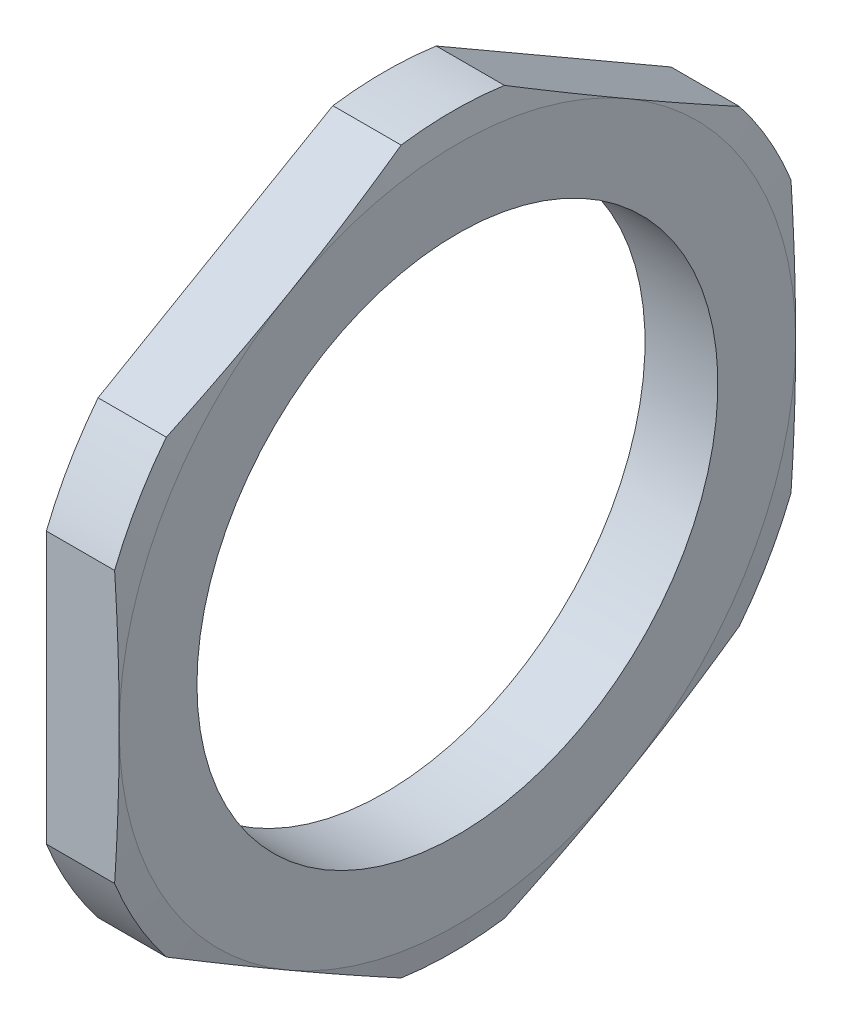
ISO-10303-21;
HEADER;
FILE_DESCRIPTION(('STEP AP214'),'2;1');
FILE_NAME('part.step','',(''),(''),'','','');
FILE_SCHEMA(('AUTOMOTIVE_DESIGN { 1 0 10303 214 1 1 1 1 }'));
ENDSEC;
DATA;
#1=APPLICATION_CONTEXT('core data for automotive mechanical design processes');
#2=APPLICATION_PROTOCOL_DEFINITION('international standard','automotive_design',2000,#1);
#3=PRODUCT_CONTEXT('',#1,'mechanical');
#4=PRODUCT('Part','Part','',(#3));
#5=PRODUCT_RELATED_PRODUCT_CATEGORY('part','',(#4));
#6=PRODUCT_DEFINITION_FORMATION('','',#4);
#7=PRODUCT_DEFINITION_CONTEXT('part definition',#1,'design');
#8=PRODUCT_DEFINITION('design','',#6,#7);
#9=PRODUCT_DEFINITION_SHAPE('','',#8);
#10=(LENGTH_UNIT() NAMED_UNIT(*) SI_UNIT(.MILLI.,.METRE.));
#11=(NAMED_UNIT(*) PLANE_ANGLE_UNIT() SI_UNIT($,.RADIAN.));
#12=(NAMED_UNIT(*) SI_UNIT($,.STERADIAN.) SOLID_ANGLE_UNIT());
#13=UNCERTAINTY_MEASURE_WITH_UNIT(LENGTH_MEASURE(1.E-05),#10,'distance_accuracy_value','');
#14=(GEOMETRIC_REPRESENTATION_CONTEXT(3) GLOBAL_UNCERTAINTY_ASSIGNED_CONTEXT((#13)) GLOBAL_UNIT_ASSIGNED_CONTEXT((#10,
#11,#12)) REPRESENTATION_CONTEXT('',''));
#15=CARTESIAN_POINT('',(0.,0.,0.));
#16=DIRECTION('',(0.,0.,1.));
#17=DIRECTION('',(1.,0.,0.));
#18=AXIS2_PLACEMENT_3D('',#15,#16,#17);
#19=CARTESIAN_POINT('',(-2.003178889877,0.,0.));
#20=DIRECTION('',(-1.,0.,0.));
#21=DIRECTION('',(0.,0.,1.));
#22=AXIS2_PLACEMENT_3D('',#19,#20,#21);
#23=CONICAL_SURFACE('',#22,17.7870529443211,1.39626340159549);
#24=CARTESIAN_POINT('',(-1.778,0.,0.));
#25=DIRECTION('',(1.,0.,0.));
#26=DIRECTION('',(0.,0.,-1.));
#27=AXIS2_PLACEMENT_3D('',#24,#25,#26);
#28=CIRCLE('',#27,16.5099999999999);
#29=CARTESIAN_POINT('',(-1.778,14.298079416481,-8.25499999999996));
#30=VERTEX_POINT('',#29);
#31=CARTESIAN_POINT('',(-1.77800000000001,14.298079416481,8.25499999999997));
#32=VERTEX_POINT('',#31);
#33=EDGE_CURVE('E109',#30,#32,#28,.T.);
#34=ORIENTED_EDGE('',*,*,#33,.F.);
#35=CARTESIAN_POINT('',(-1.77799846604757,14.2980809996564,-8.25500091404666));
#36=CARTESIAN_POINT('',(-1.77799671756424,14.4360834475584,-8.01597135449793));
#37=CARTESIAN_POINT('',(-1.77922046317279,14.5740856921921,-7.77694347656496));
#38=CARTESIAN_POINT('',(-1.78409709700538,14.8500795840297,-7.29890729471618));
#39=CARTESIAN_POINT('',(-1.78774997800014,14.9880712312639,-7.05989899074423));
#40=CARTESIAN_POINT('',(-1.80231684067896,15.4019387656885,-6.34305978118079));
#41=CARTESIAN_POINT('',(-1.81683906597744,15.6777847250945,-5.86528037984335));
#42=CARTESIAN_POINT('',(-1.85508404263868,16.2293055393274,-4.91001816049385));
#43=CARTESIAN_POINT('',(-1.87880653077253,16.5049803988236,-4.43253533438793));
#44=CARTESIAN_POINT('',(-1.93477241380698,17.0561900532299,-3.47781228118609));
#45=CARTESIAN_POINT('',(-1.96701813067364,17.3317247894409,-3.00057215575975));
#46=CARTESIAN_POINT('',(-2.00317889154779,17.6071258343017,-2.52356347973088));
#47=B_SPLINE_CURVE_WITH_KNOTS('',3,(#35,#36,#37,#38,#39,#40,#41,#42,#43,#44,#45,#46),
.UNSPECIFIED.,.F.,.F.,(4,2,2,2,2,4),(0.,0.828014944377781,1.65602742453205,3.31158757359664,
4.96710035889239,6.62306461788218),.UNSPECIFIED.);
#48=CARTESIAN_POINT('',(-2.00317889089068,17.6071258292938,-2.52356348840487));
#49=VERTEX_POINT('',#48);
#50=EDGE_CURVE('E185',#30,#49,#47,.T.);
#51=ORIENTED_EDGE('',*,*,#50,.T.);
#52=CARTESIAN_POINT('',(-2.00317888987693,0.,0.));
#53=DIRECTION('',(-1.,0.,0.));
#54=DIRECTION('',(0.,0.,1.));
#55=AXIS2_PLACEMENT_3D('',#52,#53,#54);
#56=CIRCLE('',#55,17.7870529443207);
#57=CARTESIAN_POINT('',(-2.00317889139763,17.6071258331573,2.52356348171298));
#58=VERTEX_POINT('',#57);
#59=EDGE_CURVE('E181',#58,#49,#56,.T.);
#60=ORIENTED_EDGE('',*,*,#59,.F.);
#61=CARTESIAN_POINT('',(-2.00317907456859,17.6071256533005,2.52356336486872));
#62=CARTESIAN_POINT('',(-1.96701822747545,17.3317246946323,3.00057209251378));
#63=CARTESIAN_POINT('',(-1.93477244686303,17.0561900204164,3.47781225999399));
#64=CARTESIAN_POINT('',(-1.87880649743135,16.5049804287321,4.43253536059044));
#65=CARTESIAN_POINT('',(-1.85508400655677,16.2293055699818,4.91001819204284));
#66=CARTESIAN_POINT('',(-1.81683910075202,15.6777846755708,5.86528038097433));
#67=CARTESIAN_POINT('',(-1.80231694914937,15.4019386352368,6.34305974654894));
#68=CARTESIAN_POINT('',(-1.78774992254349,14.9880712622352,7.0598990674274));
#69=CARTESIAN_POINT('',(-1.78409694112772,14.8500797153681,7.29890743707536));
#70=CARTESIAN_POINT('',(-1.77922061787423,14.5740854942387,7.77694344958506));
#71=CARTESIAN_POINT('',(-1.77799728328799,14.4360828199445,8.0159710925022));
#72=CARTESIAN_POINT('',(-1.77800000000002,14.2980793661624,8.25500008715457));
#73=B_SPLINE_CURVE_WITH_KNOTS('',3,(#61,#62,#63,#64,#65,#66,#67,#68,#69,#70,#71,#72),
.UNSPECIFIED.,.F.,.F.,(4,2,2,2,2,4),(0.,1.65596428385619,3.31147707988383,4.96703725703224,
5.79504975855749,6.62306473134729),.UNSPECIFIED.);
#74=EDGE_CURVE('E200',#58,#32,#73,.T.);
#75=ORIENTED_EDGE('',*,*,#74,.T.);
#76=EDGE_LOOP('',(#34,#51,#60,#75));
#77=FACE_BOUND('',#76,.T.);
#78=ADVANCED_FACE('F17',(#77),#23,.T.);
#79=CARTESIAN_POINT('',(-2.003178889877,0.,0.));
#80=DIRECTION('',(-1.,0.,0.));
#81=DIRECTION('',(0.,0.,1.));
#82=AXIS2_PLACEMENT_3D('',#79,#80,#81);
#83=CONICAL_SURFACE('',#82,17.7870529443211,1.39626340159546);
#84=CARTESIAN_POINT('',(-1.778,0.,0.));
#85=DIRECTION('',(1.,0.,0.));
#86=DIRECTION('',(0.,0.,-1.));
#87=AXIS2_PLACEMENT_3D('',#84,#85,#86);
#88=CIRCLE('',#87,16.5100000000001);
#89=CARTESIAN_POINT('',(-1.77800019243989,-1.51340001591407E-05,16.5100010521019));
#90=VERTEX_POINT('',#89);
#91=EDGE_CURVE('E388',#32,#90,#88,.T.);
#92=ORIENTED_EDGE('',*,*,#91,.F.);
#93=CARTESIAN_POINT('',(-1.77799846604755,14.2980809996563,8.25500091404667));
#94=CARTESIAN_POINT('',(-1.77799671756421,14.1600765527827,8.49402931948862));
#95=CARTESIAN_POINT('',(-1.77922046317275,14.022073460597,8.73305670808714));
#96=CARTESIAN_POINT('',(-1.78409709700534,13.7460789291066,9.21109252063224));
#97=CARTESIAN_POINT('',(-1.7877499780001,13.6080874897686,9.45010094463314));
#98=CARTESIAN_POINT('',(-1.80231684067892,13.1942202910702,10.1669403480282));
#99=CARTESIAN_POINT('',(-1.81683906597741,12.91837417181,10.6447196570738));
#100=CARTESIAN_POINT('',(-1.85508404263865,12.3668532296943,11.5999818025901));
#101=CARTESIAN_POINT('',(-1.87880653077251,12.0911784021639,12.0774646471515));
#102=CARTESIAN_POINT('',(-1.93477241380697,11.5399688117156,13.0321877372795));
#103=CARTESIAN_POINT('',(-1.96701813067363,11.2644341074966,13.5094278811764));
#104=CARTESIAN_POINT('',(-2.00317889154779,10.9890329986605,13.9864365202691));
#105=B_SPLINE_CURVE_WITH_KNOTS('',3,(#93,#94,#95,#96,#97,#98,#99,#100,#101,#102,#103,#104),
.UNSPECIFIED.,.F.,.F.,(4,2,2,2,2,4),(0.,0.828014944377781,1.65602742453206,3.31158757359664,
4.9671003588924,6.62306461788219),.UNSPECIFIED.);
#106=CARTESIAN_POINT('',(-2.00317889089068,10.9890330036684,13.9864365115951));
#107=VERTEX_POINT('',#106);
#108=EDGE_CURVE('E178',#32,#107,#105,.T.);
#109=ORIENTED_EDGE('',*,*,#108,.T.);
#110=CARTESIAN_POINT('',(-2.00317888987693,0.,0.));
#111=DIRECTION('',(-1.,0.,0.));
#112=DIRECTION('',(0.,0.,1.));
#113=AXIS2_PLACEMENT_3D('',#110,#111,#112);
#114=CIRCLE('',#113,17.7870529443207);
#115=CARTESIAN_POINT('',(-2.00317888897074,6.61809279636093,16.51));
#116=VERTEX_POINT('',#115);
#117=EDGE_CURVE('E174',#116,#107,#114,.T.);
#118=ORIENTED_EDGE('',*,*,#117,.F.);
#119=CARTESIAN_POINT('',(-2.00317877981935,6.6180927896501,16.5100001276313));
#120=CARTESIAN_POINT('',(-1.96701803710825,6.06728937750174,16.5100000457611));
#121=CARTESIAN_POINT('',(-1.93477226899158,5.51621867993884,16.5100000122444));
#122=CARTESIAN_POINT('',(-1.87880628803841,4.41379692625598,16.5099999877589));
#123=CARTESIAN_POINT('',(-1.85508375316174,3.8624459875375,16.5099999967786));
#124=CARTESIAN_POINT('',(-1.81683882997163,2.75940171885733,16.5100000032215));
#125=CARTESIAN_POINT('',(-1.80231670500857,2.20770837954724,16.5100000006444));
#126=CARTESIAN_POINT('',(-1.78774974606916,1.37997175446904,16.5099999996777));
#127=CARTESIAN_POINT('',(-1.78409679183247,1.10398803573921,16.5099999998389));
#128=CARTESIAN_POINT('',(-1.77922053423853,0.551998343877247,16.5100000001612));
#129=CARTESIAN_POINT('',(-1.77799723813147,0.275992370681165,16.5100000003223));
#130=CARTESIAN_POINT('',(-1.77800000000122,-1.51627719128148E-05,16.51));
#131=B_SPLINE_CURVE_WITH_KNOTS('',3,(#119,#120,#121,#122,#123,#124,#125,#126,#127,#128,#129,
#130),.UNSPECIFIED.,.F.,.F.,(4,2,2,2,2,4),(0.,1.65596802990641,3.31148457091046,
4.96704849689214,5.79506287355029,6.62307972103164),.UNSPECIFIED.);
#132=EDGE_CURVE('E198',#116,#90,#131,.T.);
#133=ORIENTED_EDGE('',*,*,#132,.T.);
#134=EDGE_LOOP('',(#92,#109,#118,#133));
#135=FACE_BOUND('',#134,.T.);
#136=ADVANCED_FACE('F316',(#135),#83,.T.);
#137=CARTESIAN_POINT('',(-2.003178889877,0.,0.));
#138=DIRECTION('',(-1.,0.,0.));
#139=DIRECTION('',(0.,0.,1.));
#140=AXIS2_PLACEMENT_3D('',#137,#138,#139);
#141=CONICAL_SURFACE('',#140,17.7870529443211,1.39626340159556);
#142=CARTESIAN_POINT('',(-1.77800000000017,0.,0.));
#143=DIRECTION('',(-1.,0.,0.));
#144=DIRECTION('',(0.,0.,1.));
#145=AXIS2_PLACEMENT_3D('',#142,#143,#144);
#146=CIRCLE('',#145,16.5100000000002);
#147=CARTESIAN_POINT('',(-1.7780011290956,-14.2980865322122,8.25499254484056));
#148=VERTEX_POINT('',#147);
#149=EDGE_CURVE('E379',#90,#148,#146,.F.);
#150=ORIENTED_EDGE('',*,*,#149,.F.);
#151=CARTESIAN_POINT('',(-1.77799956145328,-1.51340002611279E-05,16.5100005226412));
#152=CARTESIAN_POINT('',(-1.77799716605554,-0.276021875997781,16.5100001926888));
#153=CARTESIAN_POINT('',(-1.77922066169119,-0.552027058080627,16.510000052791));
#154=CARTESIAN_POINT('',(-1.78409715762046,-1.10401516835559,16.5099999472092));
#155=CARTESIAN_POINT('',(-1.78775015066951,-1.37999809661161,16.5099999815248));
#156=CARTESIAN_POINT('',(-1.80231724472291,-2.20773235198192,16.5100000369401));
#157=CARTESIAN_POINT('',(-1.81683948467552,-2.75942411119049,16.5100000105544));
#158=CARTESIAN_POINT('',(-1.85508454171437,-3.86246522297798,16.5099999894459));
#159=CARTESIAN_POINT('',(-1.87880709549238,-4.41381458490386,16.5099999947222));
#160=CARTESIAN_POINT('',(-1.9347730946568,-5.51623318198397,16.5100000052792));
#161=CARTESIAN_POINT('',(-1.96701886204711,-6.06730229973811,16.5100000105598));
#162=CARTESIAN_POINT('',(-2.00317963260143,-6.61810413104344,16.51));
#163=B_SPLINE_CURVE_WITH_KNOTS('',3,(#151,#152,#153,#154,#155,#156,#157,#158,#159,#160,#161,
#162),.UNSPECIFIED.,.F.,.F.,(4,2,2,2,2,4),(0.,0.828014476877051,1.65602648468958,
3.31158568072197,4.96709749900175,6.62306079888207),.UNSPECIFIED.);
#164=CARTESIAN_POINT('',(-2.00317888987693,-6.61809281017337,16.51));
#165=VERTEX_POINT('',#164);
#166=EDGE_CURVE('E150',#90,#165,#163,.T.);
#167=ORIENTED_EDGE('',*,*,#166,.T.);
#168=CARTESIAN_POINT('',(-2.00317888987693,0.,0.));
#169=DIRECTION('',(-1.,0.,0.));
#170=DIRECTION('',(0.,0.,1.));
#171=AXIS2_PLACEMENT_3D('',#168,#169,#170);
#172=CIRCLE('',#171,17.7870529443207);
#173=CARTESIAN_POINT('',(-2.00317913191549,-10.9890403459251,13.9864307612967));
#174=VERTEX_POINT('',#173);
#175=EDGE_CURVE('E145',#174,#165,#172,.T.);
#176=ORIENTED_EDGE('',*,*,#175,.F.);
#177=CARTESIAN_POINT('',(-2.00317694921295,-10.9890386642653,13.9864299557425));
#178=CARTESIAN_POINT('',(-1.96701713613776,-11.2644389227295,13.5094206318302));
#179=CARTESIAN_POINT('',(-1.93477180238271,-11.5399733421454,13.0321801650695));
#180=CARTESIAN_POINT('',(-1.87880623360157,-12.0911828178718,12.0774567242714));
#181=CARTESIAN_POINT('',(-1.85508367671832,-12.3668578153589,11.5999738518239));
#182=CARTESIAN_POINT('',(-1.81683878722875,-12.9183788832443,10.6447115047925));
#183=CARTESIAN_POINT('',(-1.80231671805879,-13.1942249583146,10.1669320221078));
#184=CARTESIAN_POINT('',(-1.78774978404594,-13.6080924089697,9.45009254536881));
#185=CARTESIAN_POINT('',(-1.78409682832004,-13.7460839855706,9.21108412778113));
#186=CARTESIAN_POINT('',(-1.77922055766574,-14.0220782656426,8.73304802030139));
#187=CARTESIAN_POINT('',(-1.7779972499817,-14.1600809691456,8.494020330354));
#188=CARTESIAN_POINT('',(-1.77800000000067,-14.2980844476179,8.25499128581545));
#189=B_SPLINE_CURVE_WITH_KNOTS('',3,(#177,#178,#179,#180,#181,#182,#183,#184,#185,#186,#187,
#188),.UNSPECIFIED.,.F.,.F.,(4,2,2,2,2,4),(0.,1.65596460038207,3.31147772419547,4.9670382479563,
5.79505091785781,6.62306605660022),.UNSPECIFIED.);
#190=EDGE_CURVE('E133',#174,#148,#189,.T.);
#191=ORIENTED_EDGE('',*,*,#190,.T.);
#192=EDGE_LOOP('',(#150,#167,#176,#191));
#193=FACE_BOUND('',#192,.T.);
#194=ADVANCED_FACE('F148',(#193),#141,.T.);
#195=CARTESIAN_POINT('',(-2.003178889877,0.,0.));
#196=DIRECTION('',(-1.,0.,0.));
#197=DIRECTION('',(0.,0.,1.));
#198=AXIS2_PLACEMENT_3D('',#195,#196,#197);
#199=CONICAL_SURFACE('',#198,17.7870529443211,1.39626340159549);
#200=CARTESIAN_POINT('',(-1.778,0.,0.));
#201=DIRECTION('',(1.,0.,0.));
#202=DIRECTION('',(0.,0.,-1.));
#203=AXIS2_PLACEMENT_3D('',#200,#201,#202);
#204=CIRCLE('',#203,16.5099999999999);
#205=CARTESIAN_POINT('',(-1.77800112936757,-14.2980865282967,-8.25499255357463));
#206=VERTEX_POINT('',#205);
#207=EDGE_CURVE('E374',#148,#206,#204,.T.);
#208=ORIENTED_EDGE('',*,*,#207,.F.);
#209=CARTESIAN_POINT('',(-1.77799926759856,-14.2980851794967,8.25499176384965));
#210=CARTESIAN_POINT('',(-1.77799704262961,-14.436087943221,8.01596286341289));
#211=CARTESIAN_POINT('',(-1.7792205995235,-14.5740902021391,7.77693547213164));
#212=CARTESIAN_POINT('',(-1.78409711559487,-14.8500838455292,7.2989001065578));
#213=CARTESIAN_POINT('',(-1.78775006753194,-14.9880752300326,7.05989213220947));
#214=CARTESIAN_POINT('',(-1.80231705867501,-15.4019420508162,6.3430539561392));
#215=CARTESIAN_POINT('',(-1.81683925722017,-15.677787634584,5.86527530187843));
#216=CARTESIAN_POINT('',(-1.85508419921897,-16.2293076459522,4.91001455029271));
#217=CARTESIAN_POINT('',(-1.87880667938729,-16.5049820782245,4.43253244487302));
#218=CARTESIAN_POINT('',(-1.93477251966982,-17.0561908794973,3.47781083075091));
#219=CARTESIAN_POINT('',(-1.96701820176927,-17.3317251897984,3.00057142371895));
#220=CARTESIAN_POINT('',(-2.00317889154787,-17.6071258343023,2.5235634797298));
#221=B_SPLINE_CURVE_WITH_KNOTS('',3,(#209,#210,#211,#212,#213,#214,#215,#216,#217,#218,#219,
#220),.UNSPECIFIED.,.F.,.F.,(4,2,2,2,2,4),(0.,0.82801369899923,1.6560249302481,3.31158257674454,
4.96709284948906,6.62305460039651),.UNSPECIFIED.);
#222=CARTESIAN_POINT('',(-2.00317889089073,-17.6071258292942,2.52356348840422));
#223=VERTEX_POINT('',#222);
#224=EDGE_CURVE('E141',#148,#223,#221,.T.);
#225=ORIENTED_EDGE('',*,*,#224,.T.);
#226=CARTESIAN_POINT('',(-2.00317888987693,0.,0.));
#227=DIRECTION('',(-1.,0.,0.));
#228=DIRECTION('',(0.,0.,1.));
#229=AXIS2_PLACEMENT_3D('',#226,#227,#228);
#230=CIRCLE('',#229,17.7870529443207);
#231=CARTESIAN_POINT('',(-2.00317889139763,-17.6071258331573,-2.52356348171298));
#232=VERTEX_POINT('',#231);
#233=EDGE_CURVE('E161',#232,#223,#230,.T.);
#234=ORIENTED_EDGE('',*,*,#233,.F.);
#235=CARTESIAN_POINT('',(-2.00317907456859,-17.6071256533005,-2.52356336486872));
#236=CARTESIAN_POINT('',(-1.96701828253167,-17.3317251129249,-3.00057136800982));
#237=CARTESIAN_POINT('',(-1.93477254490698,-17.0561908574286,-3.47781081024637));
#238=CARTESIAN_POINT('',(-1.87880665447275,-16.5049821033966,-4.43253245998647));
#239=CARTESIAN_POINT('',(-1.85508417962299,-16.2293076635786,-4.91001456582678));
#240=CARTESIAN_POINT('',(-1.81683927615215,-15.6777876073731,-5.86527530294379));
#241=CARTESIAN_POINT('',(-1.80231711085684,-15.4019419863123,-6.34305394231596));
#242=CARTESIAN_POINT('',(-1.78775004073019,-14.9880752423043,-7.05989217374545));
#243=CARTESIAN_POINT('',(-1.78409704097301,-14.85008390521,-7.29890018005625));
#244=CARTESIAN_POINT('',(-1.77922067345824,-14.5740901035469,-7.77693546602915));
#245=CARTESIAN_POINT('',(-1.77799731295209,-14.4360876389461,-8.01596274574665));
#246=CARTESIAN_POINT('',(-1.77800000000055,-14.2980843947946,-8.25499137730811));
#247=B_SPLINE_CURVE_WITH_KNOTS('',3,(#235,#236,#237,#238,#239,#240,#241,#242,#243,#244,#245,
#246),.UNSPECIFIED.,.F.,.F.,(4,2,2,2,2,4),(0.,1.65596176864864,3.31147205166208,
4.96702971556345,5.79504095933411,6.62305467436448),.UNSPECIFIED.);
#248=EDGE_CURVE('E195',#232,#206,#247,.T.);
#249=ORIENTED_EDGE('',*,*,#248,.T.);
#250=EDGE_LOOP('',(#208,#225,#234,#249));
#251=FACE_BOUND('',#250,.T.);
#252=ADVANCED_FACE('F323',(#251),#199,.T.);
#253=CARTESIAN_POINT('',(-2.003178889877,0.,0.));
#254=DIRECTION('',(-1.,0.,0.));
#255=DIRECTION('',(0.,0.,1.));
#256=AXIS2_PLACEMENT_3D('',#253,#254,#255);
#257=CONICAL_SURFACE('',#256,17.7870529443211,1.39626340159556);
#258=CARTESIAN_POINT('',(-1.77800000000017,0.,0.));
#259=DIRECTION('',(-1.,0.,0.));
#260=DIRECTION('',(0.,0.,1.));
#261=AXIS2_PLACEMENT_3D('',#258,#259,#260);
#262=CIRCLE('',#261,16.5100000000002);
#263=CARTESIAN_POINT('',(-1.7780001502572,-1.54263561816451E-05,-16.5100008079701));
#264=VERTEX_POINT('',#263);
#265=EDGE_CURVE('E120',#206,#264,#262,.F.);
#266=ORIENTED_EDGE('',*,*,#265,.F.);
#267=CARTESIAN_POINT('',(-1.77799926723035,-14.298085175116,-8.25499177231513));
#268=CARTESIAN_POINT('',(-1.77799698344867,-14.1600810394538,-8.4940208443012));
#269=CARTESIAN_POINT('',(-1.77922048884761,-14.0220779583684,-8.73304872483112));
#270=CARTESIAN_POINT('',(-1.78409691689137,-13.7460831745484,-9.21108536019805));
#271=CARTESIAN_POINT('',(-1.78774983229572,-13.608091471781,-9.45009411508992));
#272=CARTESIAN_POINT('',(-1.8023167367716,-13.194223559326,-10.1669345522716));
#273=CARTESIAN_POINT('',(-1.81683890808005,-12.9183770646542,-10.644714607957));
#274=CARTESIAN_POINT('',(-1.85508385473913,-12.3668553237679,-11.5999782141107));
#275=CARTESIAN_POINT('',(-1.87880636680099,-12.0911800728789,-12.0774617726722));
#276=CARTESIAN_POINT('',(-1.93477232451012,-11.5399696348082,-13.0321862923521));
#277=CARTESIAN_POINT('',(-1.96701809217266,-11.2644345063268,-13.5094271517988));
#278=CARTESIAN_POINT('',(-2.00317889154778,-10.9890329986605,-13.9864365202691));
#279=B_SPLINE_CURVE_WITH_KNOTS('',3,(#267,#268,#269,#270,#271,#272,#273,#274,#275,#276,#277,
#278),.UNSPECIFIED.,.F.,.F.,(4,2,2,2,2,4),(0.,0.828016202558456,1.65602993735857,
3.3115925864579,4.96710786134659,6.62307461876099),.UNSPECIFIED.);
#280=CARTESIAN_POINT('',(-2.00317889089068,-10.9890330036684,-13.9864365115951));
#281=VERTEX_POINT('',#280);
#282=EDGE_CURVE('E361',#206,#281,#279,.T.);
#283=ORIENTED_EDGE('',*,*,#282,.T.);
#284=CARTESIAN_POINT('',(-2.00317888987693,0.,0.));
#285=DIRECTION('',(-1.,0.,0.));
#286=DIRECTION('',(0.,0.,1.));
#287=AXIS2_PLACEMENT_3D('',#284,#285,#286);
#288=CIRCLE('',#287,17.7870529443207);
#289=CARTESIAN_POINT('',(-2.00317888762255,-6.6180927758113,-16.51));
#290=VERTEX_POINT('',#289);
#291=EDGE_CURVE('E188',#290,#281,#288,.T.);
#292=ORIENTED_EDGE('',*,*,#291,.F.);
#293=CARTESIAN_POINT('',(-2.00317861607968,-6.61809275911634,-16.5100003175164));
#294=CARTESIAN_POINT('',(-1.96701814449294,-6.06729188741381,-16.5100001138428));
#295=CARTESIAN_POINT('',(-1.93477254973528,-5.51622373645653,-16.5100000304612));
#296=CARTESIAN_POINT('',(-1.87880677966648,-4.41380708001064,-16.5099999695471));
#297=CARTESIAN_POINT('',(-1.85508428238203,-3.8624586919202,-16.5099999919859));
#298=CARTESIAN_POINT('',(-1.81683935856875,-2.75941952507059,-16.5100000080143));
#299=CARTESIAN_POINT('',(-1.80231719539624,-2.20772873696276,-16.5100000016031));
#300=CARTESIAN_POINT('',(-1.78775010556557,-1.37999593959417,-16.5099999991982));
#301=CARTESIAN_POINT('',(-1.78409709542268,-1.10401349758221,-16.5099999995991));
#302=CARTESIAN_POINT('',(-1.77922070295601,-0.552026358756787,-16.5100000004009));
#303=CARTESIAN_POINT('',(-1.77799732788163,-0.276021661879372,-16.5100000008018));
#304=CARTESIAN_POINT('',(-1.77800000000139,-1.54043278221378E-05,-16.51));
#305=B_SPLINE_CURVE_WITH_KNOTS('',3,(#293,#294,#295,#296,#297,#298,#299,#300,#301,#302,#303,
#304),.UNSPECIFIED.,.F.,.F.,(4,2,2,2,2,4),(0.,1.65596037385702,3.31146926670616,
4.96702554577414,5.79503609499462,6.62304911477441),.UNSPECIFIED.);
#306=EDGE_CURVE('E191',#290,#264,#305,.T.);
#307=ORIENTED_EDGE('',*,*,#306,.T.);
#308=EDGE_LOOP('',(#266,#283,#292,#307));
#309=FACE_BOUND('',#308,.T.);
#310=ADVANCED_FACE('F248',(#309),#257,.T.);
#311=CARTESIAN_POINT('',(-2.003178889877,0.,0.));
#312=DIRECTION('',(-1.,0.,0.));
#313=DIRECTION('',(0.,0.,1.));
#314=AXIS2_PLACEMENT_3D('',#311,#312,#313);
#315=CONICAL_SURFACE('',#314,17.7870529443211,1.39626340159549);
#316=CARTESIAN_POINT('',(-1.77799966423581,-1.54263562617189E-05,-16.5100004001497));
#317=CARTESIAN_POINT('',(-1.77799711382494,0.275992305963886,-16.5100001475283));
#318=CARTESIAN_POINT('',(-1.7792205006653,0.551998478590549,-16.5100000404183));
#319=CARTESIAN_POINT('',(-1.78409683131576,1.10398857020336,-16.5099999595818));
#320=CARTESIAN_POINT('',(-1.78774976787982,1.37997248925342,-16.5099999858548));
#321=CARTESIAN_POINT('',(-1.80231671075956,2.20770971539273,-16.5100000282824));
#322=CARTESIAN_POINT('',(-1.81683887426306,2.75940345511822,-16.5100000080808));
#323=CARTESIAN_POINT('',(-1.85508385709211,3.86244852644381,-16.5099999919195));
#324=CARTESIAN_POINT('',(-1.87880641309815,4.41379986739124,-16.5099999959592));
#325=CARTESIAN_POINT('',(-1.9347724833187,5.51622242225897,-16.5100000040419));
#326=CARTESIAN_POINT('',(-1.96701831957907,6.06729351877736,-16.5100000080849));
#327=CARTESIAN_POINT('',(-2.00317918620796,6.61809732695806,-16.51));
#328=B_SPLINE_CURVE_WITH_KNOTS('',3,(#316,#317,#318,#319,#320,#321,#322,#323,#324,#325,#326,
#327),.UNSPECIFIED.,.F.,.F.,(4,2,2,2,2,4),(0.,0.828017446928099,1.65603242433691,
3.31159755309809,4.9671153023148,6.62308453937583),.UNSPECIFIED.);
#329=CARTESIAN_POINT('',(-2.00317888987693,6.61809281017337,-16.51));
#330=VERTEX_POINT('',#329);
#331=EDGE_CURVE('E226',#264,#330,#328,.T.);
#332=ORIENTED_EDGE('',*,*,#331,.T.);
#333=CARTESIAN_POINT('',(-2.00317888987693,0.,0.));
#334=DIRECTION('',(-1.,0.,0.));
#335=DIRECTION('',(0.,0.,1.));
#336=AXIS2_PLACEMENT_3D('',#333,#334,#335);
#337=CIRCLE('',#336,17.7870529443207);
#338=CARTESIAN_POINT('',(-2.00317913164567,10.9890403372791,-13.9864307680611));
#339=VERTEX_POINT('',#338);
#340=EDGE_CURVE('E264',#339,#330,#337,.T.);
#341=ORIENTED_EDGE('',*,*,#340,.F.);
#342=CARTESIAN_POINT('',(-2.00317695150682,10.9890386575944,-13.9864299634531));
#343=CARTESIAN_POINT('',(-1.9670171918152,11.2644385032029,-13.5094213570936));
#344=CARTESIAN_POINT('',(-1.93477190011727,11.5399725087279,-13.0321816082222));
#345=CARTESIAN_POINT('',(-1.87880638929562,12.0911811559211,-12.077459603223));
#346=CARTESIAN_POINT('',(-1.85508384832945,12.3668557387664,-11.5999774486847));
#347=CARTESIAN_POINT('',(-1.81683896111945,12.9183759771748,-10.6447165381555));
#348=CARTESIAN_POINT('',(-1.80231687831014,13.19422163741,-10.1669377740639));
#349=CARTESIAN_POINT('',(-1.78774990113361,13.608088465694,-9.45009937533232));
#350=CARTESIAN_POINT('',(-1.78409692723159,13.7460798347253,-9.21109131726093));
#351=CARTESIAN_POINT('',(-1.77922061272598,14.0220736997372,-8.73305592867672));
#352=CARTESIAN_POINT('',(-1.77799727936673,14.1600761957497,-8.49402859810857));
#353=CARTESIAN_POINT('',(-1.77800000000002,14.2980794667997,-8.25499991284552));
#354=B_SPLINE_CURVE_WITH_KNOTS('',3,(#342,#343,#344,#345,#346,#347,#348,#349,#350,#351,#352,
#353),.UNSPECIFIED.,.F.,.F.,(4,2,2,2,2,4),(0.,1.65596211163898,3.3114727488675,4.96703078579342,
5.79504221116358,6.6230561053724),.UNSPECIFIED.);
#355=EDGE_CURVE('E262',#339,#30,#354,.T.);
#356=ORIENTED_EDGE('',*,*,#355,.T.);
#357=CARTESIAN_POINT('',(-1.778,0.,0.));
#358=DIRECTION('',(1.,0.,0.));
#359=DIRECTION('',(0.,0.,-1.));
#360=AXIS2_PLACEMENT_3D('',#357,#358,#359);
#361=CIRCLE('',#360,16.5099999999999);
#362=EDGE_CURVE('E116',#264,#30,#361,.T.);
#363=ORIENTED_EDGE('',*,*,#362,.F.);
#364=EDGE_LOOP('',(#332,#341,#356,#363));
#365=FACE_BOUND('',#364,.T.);
#366=ADVANCED_FACE('F242',(#365),#315,.T.);
#367=CARTESIAN_POINT('',(-1.778,0.,0.));
#368=DIRECTION('',(1.,0.,0.));
#369=DIRECTION('',(0.,0.,-1.));
#370=AXIS2_PLACEMENT_3D('',#367,#368,#369);
#371=PLANE('',#370);
#372=CARTESIAN_POINT('',(-1.778,0.,0.));
#373=DIRECTION('',(-1.,0.,0.));
#374=DIRECTION('',(0.,0.,1.));
#375=AXIS2_PLACEMENT_3D('',#372,#373,#374);
#376=CIRCLE('',#375,12.7160438074718);
#377=CARTESIAN_POINT('',(-1.778,0.,12.7160438074718));
#378=VERTEX_POINT('',#377);
#379=EDGE_CURVE('E223',#378,#378,#376,.T.);
#380=ORIENTED_EDGE('',*,*,#379,.T.);
#381=EDGE_LOOP('',(#380));
#382=FACE_BOUND('',#381,.T.);
#383=ORIENTED_EDGE('',*,*,#207,.T.);
#384=ORIENTED_EDGE('',*,*,#265,.T.);
#385=ORIENTED_EDGE('',*,*,#362,.T.);
#386=ORIENTED_EDGE('',*,*,#33,.T.);
#387=ORIENTED_EDGE('',*,*,#91,.T.);
#388=ORIENTED_EDGE('',*,*,#149,.T.);
#389=EDGE_LOOP('',(#383,#384,#385,#386,#387,#388));
#390=FACE_BOUND('',#389,.T.);
#391=ADVANCED_FACE('F247',(#382,#390),#371,.T.);
#392=CARTESIAN_POINT('',(-1.778,0.,0.));
#393=DIRECTION('',(-1.,0.,0.));
#394=DIRECTION('',(0.,0.,1.));
#395=AXIS2_PLACEMENT_3D('',#392,#393,#394);
#396=CYLINDRICAL_SURFACE('',#395,17.7870529443207);
#397=DIRECTION('',(1.,0.,0.));
#398=VECTOR('',#397,1.);
#399=CARTESIAN_POINT('',(-1.778,10.9890330113944,-13.9864364982133));
#400=LINE('',#399,#398);
#401=CARTESIAN_POINT('',(-5.334,10.9890330113944,-13.9864364982133));
#402=VERTEX_POINT('',#401);
#403=EDGE_CURVE('E182',#402,#339,#400,.T.);
#404=ORIENTED_EDGE('',*,*,#403,.T.);
#405=ORIENTED_EDGE('',*,*,#340,.T.);
#406=DIRECTION('',(1.,0.,0.));
#407=VECTOR('',#406,1.);
#408=CARTESIAN_POINT('',(-1.778,6.61809281017337,-16.51));
#409=LINE('',#408,#407);
#410=CARTESIAN_POINT('',(-5.334,6.61809281017337,-16.51));
#411=VERTEX_POINT('',#410);
#412=EDGE_CURVE('E229',#330,#411,#409,.F.);
#413=ORIENTED_EDGE('',*,*,#412,.T.);
#414=CARTESIAN_POINT('',(-5.334,0.,0.));
#415=DIRECTION('',(-1.,0.,0.));
#416=DIRECTION('',(0.,0.,1.));
#417=AXIS2_PLACEMENT_3D('',#414,#415,#416);
#418=CIRCLE('',#417,17.7870529443207);
#419=EDGE_CURVE('E220',#411,#402,#418,.F.);
#420=ORIENTED_EDGE('',*,*,#419,.T.);
#421=EDGE_LOOP('',(#404,#405,#413,#420));
#422=FACE_BOUND('',#421,.T.);
#423=ADVANCED_FACE('F271',(#422),#396,.T.);
#424=CARTESIAN_POINT('',(-1.778,10.9890330113944,-13.9864364982133));
#425=DIRECTION('',(0.,-0.866025403784439,0.5));
#426=DIRECTION('',(0.,-0.5,-0.866025403784439));
#427=AXIS2_PLACEMENT_3D('',#424,#425,#426);
#428=PLANE('',#427);
#429=DIRECTION('',(0.,0.499999999999999,0.866025403784439));
#430=VECTOR('',#429,1.);
#431=CARTESIAN_POINT('',(-5.334,10.9890330113944,-13.9864364982133));
#432=LINE('',#431,#430);
#433=CARTESIAN_POINT('',(-5.334,17.6071258215678,-2.52356350178669));
#434=VERTEX_POINT('',#433);
#435=EDGE_CURVE('E219',#402,#434,#432,.T.);
#436=ORIENTED_EDGE('',*,*,#435,.T.);
#437=DIRECTION('',(-1.,0.,0.));
#438=VECTOR('',#437,1.);
#439=CARTESIAN_POINT('',(-1.778,17.6071258215678,-2.5235635017867));
#440=LINE('',#439,#438);
#441=EDGE_CURVE('E179',#49,#434,#440,.T.);
#442=ORIENTED_EDGE('',*,*,#441,.F.);
#443=ORIENTED_EDGE('',*,*,#50,.F.);
#444=ORIENTED_EDGE('',*,*,#355,.F.);
#445=ORIENTED_EDGE('',*,*,#403,.F.);
#446=EDGE_LOOP('',(#436,#442,#443,#444,#445));
#447=FACE_BOUND('',#446,.T.);
#448=ADVANCED_FACE('F266',(#447),#428,.F.);
#449=CARTESIAN_POINT('',(-1.778,0.,0.));
#450=DIRECTION('',(-1.,0.,0.));
#451=DIRECTION('',(0.,0.,1.));
#452=AXIS2_PLACEMENT_3D('',#449,#450,#451);
#453=CYLINDRICAL_SURFACE('',#452,17.7870529443207);
#454=DIRECTION('',(1.,0.,0.));
#455=VECTOR('',#454,1.);
#456=CARTESIAN_POINT('',(-1.778,17.6071258215678,2.52356350178672));
#457=LINE('',#456,#455);
#458=CARTESIAN_POINT('',(-5.334,17.6071258215678,2.52356350178672));
#459=VERTEX_POINT('',#458);
#460=EDGE_CURVE('E175',#459,#58,#457,.T.);
#461=ORIENTED_EDGE('',*,*,#460,.T.);
#462=ORIENTED_EDGE('',*,*,#59,.T.);
#463=ORIENTED_EDGE('',*,*,#441,.T.);
#464=CARTESIAN_POINT('',(-5.334,0.,0.));
#465=DIRECTION('',(-1.,0.,0.));
#466=DIRECTION('',(0.,0.,1.));
#467=AXIS2_PLACEMENT_3D('',#464,#465,#466);
#468=CIRCLE('',#467,17.7870529443207);
#469=EDGE_CURVE('E216',#434,#459,#468,.F.);
#470=ORIENTED_EDGE('',*,*,#469,.T.);
#471=EDGE_LOOP('',(#461,#462,#463,#470));
#472=FACE_BOUND('',#471,.T.);
#473=ADVANCED_FACE('F270',(#472),#453,.T.);
#474=CARTESIAN_POINT('',(-1.778,17.6071258215678,2.52356350178672));
#475=DIRECTION('',(0.,-0.866025403784438,-0.500000000000001));
#476=DIRECTION('',(0.,0.500000000000001,-0.866025403784438));
#477=AXIS2_PLACEMENT_3D('',#474,#475,#476);
#478=PLANE('',#477);
#479=DIRECTION('',(0.,-0.500000000000001,0.866025403784438));
#480=VECTOR('',#479,1.);
#481=CARTESIAN_POINT('',(-5.334,17.6071258215678,2.52356350178672));
#482=LINE('',#481,#480);
#483=CARTESIAN_POINT('',(-5.334,10.9890330113944,13.9864364982133));
#484=VERTEX_POINT('',#483);
#485=EDGE_CURVE('E215',#459,#484,#482,.T.);
#486=ORIENTED_EDGE('',*,*,#485,.T.);
#487=DIRECTION('',(-1.,0.,0.));
#488=VECTOR('',#487,1.);
#489=CARTESIAN_POINT('',(-1.778,10.9890330113944,13.9864364982133));
#490=LINE('',#489,#488);
#491=EDGE_CURVE('E172',#107,#484,#490,.T.);
#492=ORIENTED_EDGE('',*,*,#491,.F.);
#493=ORIENTED_EDGE('',*,*,#108,.F.);
#494=ORIENTED_EDGE('',*,*,#74,.F.);
#495=ORIENTED_EDGE('',*,*,#460,.F.);
#496=EDGE_LOOP('',(#486,#492,#493,#494,#495));
#497=FACE_BOUND('',#496,.T.);
#498=ADVANCED_FACE('F287',(#497),#478,.F.);
#499=CARTESIAN_POINT('',(-1.778,0.,0.));
#500=DIRECTION('',(-1.,0.,0.));
#501=DIRECTION('',(0.,0.,1.));
#502=AXIS2_PLACEMENT_3D('',#499,#500,#501);
#503=CYLINDRICAL_SURFACE('',#502,17.7870529443207);
#504=DIRECTION('',(-1.,0.,0.));
#505=VECTOR('',#504,1.);
#506=CARTESIAN_POINT('',(-1.778,6.61809281017336,16.51));
#507=LINE('',#506,#505);
#508=CARTESIAN_POINT('',(-5.334,6.61809281017336,16.51));
#509=VERTEX_POINT('',#508);
#510=EDGE_CURVE('E169',#509,#116,#507,.F.);
#511=ORIENTED_EDGE('',*,*,#510,.T.);
#512=ORIENTED_EDGE('',*,*,#117,.T.);
#513=ORIENTED_EDGE('',*,*,#491,.T.);
#514=CARTESIAN_POINT('',(-5.334,0.,0.));
#515=DIRECTION('',(-1.,0.,0.));
#516=DIRECTION('',(0.,0.,1.));
#517=AXIS2_PLACEMENT_3D('',#514,#515,#516);
#518=CIRCLE('',#517,17.7870529443207);
#519=EDGE_CURVE('E212',#484,#509,#518,.F.);
#520=ORIENTED_EDGE('',*,*,#519,.T.);
#521=EDGE_LOOP('',(#511,#512,#513,#520));
#522=FACE_BOUND('',#521,.T.);
#523=ADVANCED_FACE('F291',(#522),#503,.T.);
#524=CARTESIAN_POINT('',(-1.778,6.61809281017336,16.51));
#525=DIRECTION('',(0.,0.,-1.));
#526=DIRECTION('',(-1.,0.,0.));
#527=AXIS2_PLACEMENT_3D('',#524,#525,#526);
#528=PLANE('',#527);
#529=DIRECTION('',(0.,1.,0.));
#530=VECTOR('',#529,1.);
#531=CARTESIAN_POINT('',(-5.334,0.,16.51));
#532=LINE('',#531,#530);
#533=CARTESIAN_POINT('',(-5.334,-6.61809281017337,16.51));
#534=VERTEX_POINT('',#533);
#535=EDGE_CURVE('E211',#509,#534,#532,.F.);
#536=ORIENTED_EDGE('',*,*,#535,.T.);
#537=DIRECTION('',(-1.,0.,0.));
#538=VECTOR('',#537,1.);
#539=CARTESIAN_POINT('',(-1.778,-6.61809281017337,16.51));
#540=LINE('',#539,#538);
#541=EDGE_CURVE('E153',#165,#534,#540,.T.);
#542=ORIENTED_EDGE('',*,*,#541,.F.);
#543=ORIENTED_EDGE('',*,*,#166,.F.);
#544=ORIENTED_EDGE('',*,*,#132,.F.);
#545=ORIENTED_EDGE('',*,*,#510,.F.);
#546=EDGE_LOOP('',(#536,#542,#543,#544,#545));
#547=FACE_BOUND('',#546,.T.);
#548=ADVANCED_FACE('F296',(#547),#528,.F.);
#549=CARTESIAN_POINT('',(-1.778,0.,0.));
#550=DIRECTION('',(-1.,0.,0.));
#551=DIRECTION('',(0.,0.,1.));
#552=AXIS2_PLACEMENT_3D('',#549,#550,#551);
#553=CYLINDRICAL_SURFACE('',#552,17.7870529443207);
#554=DIRECTION('',(1.,0.,0.));
#555=VECTOR('',#554,1.);
#556=CARTESIAN_POINT('',(-1.778,-10.9890330113944,13.9864364982133));
#557=LINE('',#556,#555);
#558=CARTESIAN_POINT('',(-5.334,-10.9890330113944,13.9864364982133));
#559=VERTEX_POINT('',#558);
#560=EDGE_CURVE('E138',#559,#174,#557,.T.);
#561=ORIENTED_EDGE('',*,*,#560,.T.);
#562=ORIENTED_EDGE('',*,*,#175,.T.);
#563=ORIENTED_EDGE('',*,*,#541,.T.);
#564=CARTESIAN_POINT('',(-5.334,0.,0.));
#565=DIRECTION('',(-1.,0.,0.));
#566=DIRECTION('',(0.,0.,1.));
#567=AXIS2_PLACEMENT_3D('',#564,#565,#566);
#568=CIRCLE('',#567,17.7870529443207);
#569=EDGE_CURVE('E158',#534,#559,#568,.F.);
#570=ORIENTED_EDGE('',*,*,#569,.T.);
#571=EDGE_LOOP('',(#561,#562,#563,#570));
#572=FACE_BOUND('',#571,.T.);
#573=ADVANCED_FACE('F156',(#572),#553,.T.);
#574=CARTESIAN_POINT('',(-1.778,-10.9890330113944,13.9864364982133));
#575=DIRECTION('',(0.,0.866025403784439,-0.5));
#576=DIRECTION('',(0.,0.5,0.866025403784439));
#577=AXIS2_PLACEMENT_3D('',#574,#575,#576);
#578=PLANE('',#577);
#579=DIRECTION('',(0.,-0.5,-0.866025403784439));
#580=VECTOR('',#579,1.);
#581=CARTESIAN_POINT('',(-5.334,-10.9890330113944,13.9864364982133));
#582=LINE('',#581,#580);
#583=CARTESIAN_POINT('',(-5.334,-17.6071258215678,2.5235635017867));
#584=VERTEX_POINT('',#583);
#585=EDGE_CURVE('E209',#559,#584,#582,.T.);
#586=ORIENTED_EDGE('',*,*,#585,.T.);
#587=DIRECTION('',(-1.,0.,0.));
#588=VECTOR('',#587,1.);
#589=CARTESIAN_POINT('',(-1.778,-17.6071258215678,2.52356350178671));
#590=LINE('',#589,#588);
#591=EDGE_CURVE('E159',#223,#584,#590,.T.);
#592=ORIENTED_EDGE('',*,*,#591,.F.);
#593=ORIENTED_EDGE('',*,*,#224,.F.);
#594=ORIENTED_EDGE('',*,*,#190,.F.);
#595=ORIENTED_EDGE('',*,*,#560,.F.);
#596=EDGE_LOOP('',(#586,#592,#593,#594,#595));
#597=FACE_BOUND('',#596,.T.);
#598=ADVANCED_FACE('F136',(#597),#578,.F.);
#599=CARTESIAN_POINT('',(-1.778,0.,0.));
#600=DIRECTION('',(-1.,0.,0.));
#601=DIRECTION('',(0.,0.,1.));
#602=AXIS2_PLACEMENT_3D('',#599,#600,#601);
#603=CYLINDRICAL_SURFACE('',#602,17.7870529443207);
#604=DIRECTION('',(1.,0.,0.));
#605=VECTOR('',#604,1.);
#606=CARTESIAN_POINT('',(-1.778,-17.6071258215678,-2.52356350178671));
#607=LINE('',#606,#605);
#608=CARTESIAN_POINT('',(-5.334,-17.6071258215678,-2.52356350178671));
#609=VERTEX_POINT('',#608);
#610=EDGE_CURVE('E362',#609,#232,#607,.T.);
#611=ORIENTED_EDGE('',*,*,#610,.T.);
#612=ORIENTED_EDGE('',*,*,#233,.T.);
#613=ORIENTED_EDGE('',*,*,#591,.T.);
#614=CARTESIAN_POINT('',(-5.334,0.,0.));
#615=DIRECTION('',(-1.,0.,0.));
#616=DIRECTION('',(0.,0.,1.));
#617=AXIS2_PLACEMENT_3D('',#614,#615,#616);
#618=CIRCLE('',#617,17.7870529443207);
#619=EDGE_CURVE('E206',#584,#609,#618,.F.);
#620=ORIENTED_EDGE('',*,*,#619,.T.);
#621=EDGE_LOOP('',(#611,#612,#613,#620));
#622=FACE_BOUND('',#621,.T.);
#623=ADVANCED_FACE('F336',(#622),#603,.T.);
#624=CARTESIAN_POINT('',(-1.778,-17.6071258215678,-2.52356350178671));
#625=DIRECTION('',(0.,0.866025403784439,0.5));
#626=DIRECTION('',(0.,-0.5,0.866025403784439));
#627=AXIS2_PLACEMENT_3D('',#624,#625,#626);
#628=PLANE('',#627);
#629=DIRECTION('',(0.,0.5,-0.866025403784439));
#630=VECTOR('',#629,1.);
#631=CARTESIAN_POINT('',(-5.334,-17.6071258215678,-2.52356350178671));
#632=LINE('',#631,#630);
#633=CARTESIAN_POINT('',(-5.334,-10.9890330113944,-13.9864364982133));
#634=VERTEX_POINT('',#633);
#635=EDGE_CURVE('E205',#609,#634,#632,.T.);
#636=ORIENTED_EDGE('',*,*,#635,.T.);
#637=DIRECTION('',(-1.,0.,0.));
#638=VECTOR('',#637,1.);
#639=CARTESIAN_POINT('',(-1.778,-10.9890330113944,-13.9864364982133));
#640=LINE('',#639,#638);
#641=EDGE_CURVE('E192',#281,#634,#640,.T.);
#642=ORIENTED_EDGE('',*,*,#641,.F.);
#643=ORIENTED_EDGE('',*,*,#282,.F.);
#644=ORIENTED_EDGE('',*,*,#248,.F.);
#645=ORIENTED_EDGE('',*,*,#610,.F.);
#646=EDGE_LOOP('',(#636,#642,#643,#644,#645));
#647=FACE_BOUND('',#646,.T.);
#648=ADVANCED_FACE('F350',(#647),#628,.F.);
#649=CARTESIAN_POINT('',(-1.778,0.,0.));
#650=DIRECTION('',(-1.,0.,0.));
#651=DIRECTION('',(0.,0.,1.));
#652=AXIS2_PLACEMENT_3D('',#649,#650,#651);
#653=CYLINDRICAL_SURFACE('',#652,17.7870529443207);
#654=DIRECTION('',(1.,0.,0.));
#655=VECTOR('',#654,1.);
#656=CARTESIAN_POINT('',(-1.778,-6.61809281017337,-16.51));
#657=LINE('',#656,#655);
#658=CARTESIAN_POINT('',(-5.334,-6.61809281017337,-16.51));
#659=VERTEX_POINT('',#658);
#660=EDGE_CURVE('E36',#659,#290,#657,.T.);
#661=ORIENTED_EDGE('',*,*,#660,.T.);
#662=ORIENTED_EDGE('',*,*,#291,.T.);
#663=ORIENTED_EDGE('',*,*,#641,.T.);
#664=CARTESIAN_POINT('',(-5.334,0.,0.));
#665=DIRECTION('',(-1.,0.,0.));
#666=DIRECTION('',(0.,0.,1.));
#667=AXIS2_PLACEMENT_3D('',#664,#665,#666);
#668=CIRCLE('',#667,17.7870529443207);
#669=EDGE_CURVE('E202',#634,#659,#668,.F.);
#670=ORIENTED_EDGE('',*,*,#669,.T.);
#671=EDGE_LOOP('',(#661,#662,#663,#670));
#672=FACE_BOUND('',#671,.T.);
#673=ADVANCED_FACE('F353',(#672),#653,.T.);
#674=CARTESIAN_POINT('',(-1.778,-6.61809281017337,-16.51));
#675=DIRECTION('',(0.,0.,1.));
#676=DIRECTION('',(1.,0.,0.));
#677=AXIS2_PLACEMENT_3D('',#674,#675,#676);
#678=PLANE('',#677);
#679=DIRECTION('',(0.,1.,0.));
#680=VECTOR('',#679,1.);
#681=CARTESIAN_POINT('',(-5.334,0.,-16.51));
#682=LINE('',#681,#680);
#683=EDGE_CURVE('E27',#659,#411,#682,.T.);
#684=ORIENTED_EDGE('',*,*,#683,.T.);
#685=ORIENTED_EDGE('',*,*,#412,.F.);
#686=ORIENTED_EDGE('',*,*,#331,.F.);
#687=ORIENTED_EDGE('',*,*,#306,.F.);
#688=ORIENTED_EDGE('',*,*,#660,.F.);
#689=EDGE_LOOP('',(#684,#685,#686,#687,#688));
#690=FACE_BOUND('',#689,.T.);
#691=ADVANCED_FACE('F238',(#690),#678,.F.);
#692=CARTESIAN_POINT('',(-1.778,0.,0.));
#693=DIRECTION('',(-1.,0.,0.));
#694=DIRECTION('',(0.,0.,1.));
#695=AXIS2_PLACEMENT_3D('',#692,#693,#694);
#696=CYLINDRICAL_SURFACE('',#695,12.7160438074718);
#697=CARTESIAN_POINT('',(-5.334,0.,0.));
#698=DIRECTION('',(-1.,0.,0.));
#699=DIRECTION('',(0.,0.,1.));
#700=AXIS2_PLACEMENT_3D('',#697,#698,#699);
#701=CIRCLE('',#700,12.7160438074718);
#702=CARTESIAN_POINT('',(-5.334,0.,12.7160438074718));
#703=VERTEX_POINT('',#702);
#704=EDGE_CURVE('E11',#703,#703,#701,.T.);
#705=ORIENTED_EDGE('',*,*,#704,.T.);
#706=EDGE_LOOP('',(#705));
#707=FACE_BOUND('',#706,.T.);
#708=ORIENTED_EDGE('',*,*,#379,.F.);
#709=EDGE_LOOP('',(#708));
#710=FACE_BOUND('',#709,.T.);
#711=ADVANCED_FACE('F425',(#707,#710),#696,.F.);
#712=CARTESIAN_POINT('',(-5.334,0.,0.));
#713=DIRECTION('',(1.,0.,0.));
#714=DIRECTION('',(0.,0.,-1.));
#715=AXIS2_PLACEMENT_3D('',#712,#713,#714);
#716=PLANE('',#715);
#717=ORIENTED_EDGE('',*,*,#704,.F.);
#718=EDGE_LOOP('',(#717));
#719=FACE_BOUND('',#718,.T.);
#720=ORIENTED_EDGE('',*,*,#669,.F.);
#721=ORIENTED_EDGE('',*,*,#635,.F.);
#722=ORIENTED_EDGE('',*,*,#619,.F.);
#723=ORIENTED_EDGE('',*,*,#585,.F.);
#724=ORIENTED_EDGE('',*,*,#569,.F.);
#725=ORIENTED_EDGE('',*,*,#535,.F.);
#726=ORIENTED_EDGE('',*,*,#519,.F.);
#727=ORIENTED_EDGE('',*,*,#485,.F.);
#728=ORIENTED_EDGE('',*,*,#469,.F.);
#729=ORIENTED_EDGE('',*,*,#435,.F.);
#730=ORIENTED_EDGE('',*,*,#419,.F.);
#731=ORIENTED_EDGE('',*,*,#683,.F.);
#732=EDGE_LOOP('',(#720,#721,#722,#723,#724,#725,#726,#727,#728,#729,#730,#731));
#733=FACE_BOUND('',#732,.T.);
#734=ADVANCED_FACE('F402',(#719,#733),#716,.F.);
#735=CLOSED_SHELL('',(#78,#136,#194,#252,#310,#366,#391,#423,#448,#473,#498,#523,#548,#573,#598,
#623,#648,#673,#691,#711,#734));
#736=MANIFOLD_SOLID_BREP('B1',#735);
#737=ADVANCED_BREP_SHAPE_REPRESENTATION('',(#18,#736),#14);
#738=SHAPE_DEFINITION_REPRESENTATION(#9,#737);
ENDSEC;
END-ISO-10303-21;
